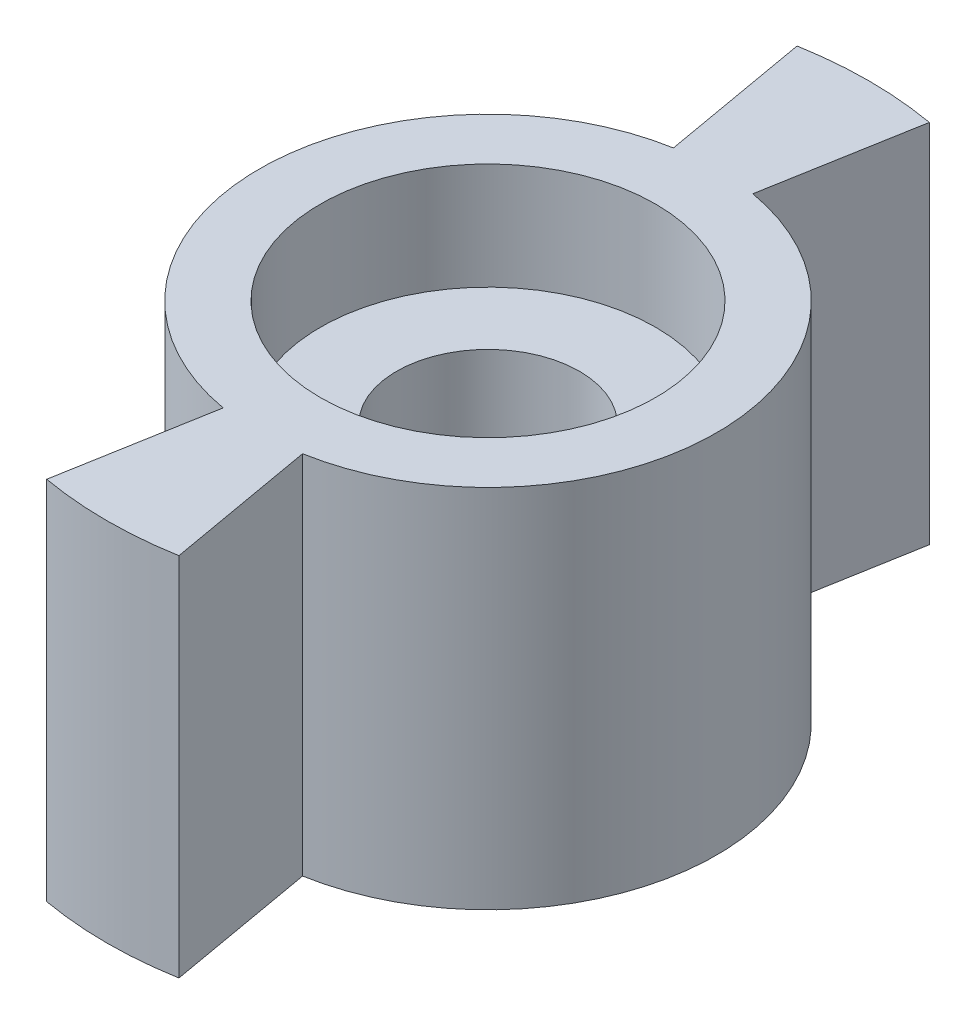
ISO-10303-21;
HEADER;
FILE_DESCRIPTION(('STEP AP214'),'2;1');
FILE_NAME('part.step','',(''),(''),'','','');
FILE_SCHEMA(('AUTOMOTIVE_DESIGN { 1 0 10303 214 1 1 1 1 }'));
ENDSEC;
DATA;
#1=APPLICATION_CONTEXT('core data for automotive mechanical design processes');
#2=APPLICATION_PROTOCOL_DEFINITION('international standard','automotive_design',2000,#1);
#3=PRODUCT_CONTEXT('',#1,'mechanical');
#4=PRODUCT('Part','Part','',(#3));
#5=PRODUCT_RELATED_PRODUCT_CATEGORY('part','',(#4));
#6=PRODUCT_DEFINITION_FORMATION('','',#4);
#7=PRODUCT_DEFINITION_CONTEXT('part definition',#1,'design');
#8=PRODUCT_DEFINITION('design','',#6,#7);
#9=PRODUCT_DEFINITION_SHAPE('','',#8);
#10=(LENGTH_UNIT() NAMED_UNIT(*) SI_UNIT(.MILLI.,.METRE.));
#11=(NAMED_UNIT(*) PLANE_ANGLE_UNIT() SI_UNIT($,.RADIAN.));
#12=(NAMED_UNIT(*) SI_UNIT($,.STERADIAN.) SOLID_ANGLE_UNIT());
#13=UNCERTAINTY_MEASURE_WITH_UNIT(LENGTH_MEASURE(1.E-05),#10,'distance_accuracy_value','');
#14=(GEOMETRIC_REPRESENTATION_CONTEXT(3) GLOBAL_UNCERTAINTY_ASSIGNED_CONTEXT((#13)) GLOBAL_UNIT_ASSIGNED_CONTEXT((#10,
#11,#12)) REPRESENTATION_CONTEXT('',''));
#15=CARTESIAN_POINT('',(0.,0.,0.));
#16=DIRECTION('',(0.,0.,1.));
#17=DIRECTION('',(1.,0.,0.));
#18=AXIS2_PLACEMENT_3D('',#15,#16,#17);
#19=CARTESIAN_POINT('',(11.,24.,0.));
#20=DIRECTION('',(0.,1.,0.));
#21=DIRECTION('',(0.,0.,1.));
#22=AXIS2_PLACEMENT_3D('',#19,#20,#21);
#23=PLANE('',#22);
#24=CARTESIAN_POINT('',(0.,24.,0.));
#25=DIRECTION('',(0.,-1.,0.));
#26=DIRECTION('',(0.,0.,-1.));
#27=AXIS2_PLACEMENT_3D('',#24,#25,#26);
#28=CIRCLE('',#27,11.);
#29=CARTESIAN_POINT('',(0.,24.,-11.));
#30=VERTEX_POINT('',#29);
#31=EDGE_CURVE('E129',#30,#30,#28,.T.);
#32=ORIENTED_EDGE('',*,*,#31,.T.);
#33=EDGE_LOOP('',(#32));
#34=FACE_BOUND('',#33,.T.);
#35=CARTESIAN_POINT('',(0.,24.,0.));
#36=DIRECTION('',(0.,1.,0.));
#37=DIRECTION('',(0.,0.,1.));
#38=AXIS2_PLACEMENT_3D('',#35,#36,#37);
#39=CIRCLE('',#38,15.);
#40=CARTESIAN_POINT('',(2.60472266500397,24.,14.7721162951831));
#41=VERTEX_POINT('',#40);
#42=CARTESIAN_POINT('',(2.60472266500396,24.,-14.7721162951831));
#43=VERTEX_POINT('',#42);
#44=EDGE_CURVE('E112',#41,#43,#39,.T.);
#45=ORIENTED_EDGE('',*,*,#44,.T.);
#46=DIRECTION('',(0.173648177666931,0.,-0.984807753012208));
#47=VECTOR('',#46,1.);
#48=CARTESIAN_POINT('',(0.,24.,0.));
#49=LINE('',#48,#47);
#50=CARTESIAN_POINT('',(4.34120444167327,24.,-24.6201938253052));
#51=VERTEX_POINT('',#50);
#52=EDGE_CURVE('E109',#43,#51,#49,.T.);
#53=ORIENTED_EDGE('',*,*,#52,.T.);
#54=CARTESIAN_POINT('',(0.,24.,0.));
#55=DIRECTION('',(0.,-1.,0.));
#56=DIRECTION('',(0.,0.,-1.));
#57=AXIS2_PLACEMENT_3D('',#54,#55,#56);
#58=CIRCLE('',#57,25.);
#59=CARTESIAN_POINT('',(-4.34120444167328,24.,-24.6201938253052));
#60=VERTEX_POINT('',#59);
#61=EDGE_CURVE('E167',#60,#51,#58,.T.);
#62=ORIENTED_EDGE('',*,*,#61,.F.);
#63=DIRECTION('',(-0.173648177666931,0.,-0.984807753012208));
#64=VECTOR('',#63,1.);
#65=CARTESIAN_POINT('',(0.,24.,0.));
#66=LINE('',#65,#64);
#67=CARTESIAN_POINT('',(-2.60472266500397,24.,-14.7721162951831));
#68=VERTEX_POINT('',#67);
#69=EDGE_CURVE('E136',#68,#60,#66,.T.);
#70=ORIENTED_EDGE('',*,*,#69,.F.);
#71=CARTESIAN_POINT('',(0.,24.,0.));
#72=DIRECTION('',(0.,1.,0.));
#73=DIRECTION('',(0.,0.,1.));
#74=AXIS2_PLACEMENT_3D('',#71,#72,#73);
#75=CIRCLE('',#74,15.);
#76=CARTESIAN_POINT('',(-2.60472266500396,24.,14.7721162951831));
#77=VERTEX_POINT('',#76);
#78=EDGE_CURVE('E133',#68,#77,#75,.T.);
#79=ORIENTED_EDGE('',*,*,#78,.T.);
#80=DIRECTION('',(-0.173648177666931,0.,0.984807753012208));
#81=VECTOR('',#80,1.);
#82=CARTESIAN_POINT('',(0.,24.,0.));
#83=LINE('',#82,#81);
#84=CARTESIAN_POINT('',(-4.34120444167327,24.,24.6201938253052));
#85=VERTEX_POINT('',#84);
#86=EDGE_CURVE('E138',#77,#85,#83,.T.);
#87=ORIENTED_EDGE('',*,*,#86,.T.);
#88=CARTESIAN_POINT('',(4.34120444167328,24.,24.6201938253052));
#89=VERTEX_POINT('',#88);
#90=EDGE_CURVE('E124',#89,#85,#58,.T.);
#91=ORIENTED_EDGE('',*,*,#90,.F.);
#92=DIRECTION('',(0.173648177666931,0.,0.984807753012208));
#93=VECTOR('',#92,1.);
#94=CARTESIAN_POINT('',(0.,24.,0.));
#95=LINE('',#94,#93);
#96=EDGE_CURVE('E105',#41,#89,#95,.T.);
#97=ORIENTED_EDGE('',*,*,#96,.F.);
#98=EDGE_LOOP('',(#45,#53,#62,#70,#79,#87,#91,#97));
#99=FACE_BOUND('',#98,.T.);
#100=ADVANCED_FACE('F39',(#34,#99),#23,.T.);
#101=CARTESIAN_POINT('',(0.,0.,0.));
#102=DIRECTION('',(0.,-1.,0.));
#103=DIRECTION('',(0.,0.,-1.));
#104=AXIS2_PLACEMENT_3D('',#101,#102,#103);
#105=CYLINDRICAL_SURFACE('',#104,25.);
#106=ORIENTED_EDGE('',*,*,#61,.T.);
#107=DIRECTION('',(0.,1.,0.));
#108=VECTOR('',#107,1.);
#109=CARTESIAN_POINT('',(4.34120444167327,-76.,-24.6201938253052));
#110=LINE('',#109,#108);
#111=CARTESIAN_POINT('',(4.34120444167327,0.,-24.6201938253052));
#112=VERTEX_POINT('',#111);
#113=EDGE_CURVE('E130',#112,#51,#110,.T.);
#114=ORIENTED_EDGE('',*,*,#113,.F.);
#115=CARTESIAN_POINT('',(0.,0.,0.));
#116=DIRECTION('',(0.,-1.,0.));
#117=DIRECTION('',(0.,0.,-1.));
#118=AXIS2_PLACEMENT_3D('',#115,#116,#117);
#119=CIRCLE('',#118,25.);
#120=CARTESIAN_POINT('',(-4.34120444167328,0.,-24.6201938253052));
#121=VERTEX_POINT('',#120);
#122=EDGE_CURVE('E163',#121,#112,#119,.T.);
#123=ORIENTED_EDGE('',*,*,#122,.F.);
#124=DIRECTION('',(0.,1.,0.));
#125=VECTOR('',#124,1.);
#126=CARTESIAN_POINT('',(-4.34120444167328,-76.,-24.6201938253052));
#127=LINE('',#126,#125);
#128=EDGE_CURVE('E53',#121,#60,#127,.T.);
#129=ORIENTED_EDGE('',*,*,#128,.T.);
#130=EDGE_LOOP('',(#106,#114,#123,#129));
#131=FACE_BOUND('',#130,.T.);
#132=ADVANCED_FACE('F188',(#131),#105,.T.);
#133=DIRECTION('',(0.,1.,0.));
#134=VECTOR('',#133,1.);
#135=CARTESIAN_POINT('',(4.34120444167328,-76.,24.6201938253052));
#136=LINE('',#135,#134);
#137=CARTESIAN_POINT('',(4.34120444167328,0.,24.6201938253052));
#138=VERTEX_POINT('',#137);
#139=EDGE_CURVE('E61',#138,#89,#136,.T.);
#140=ORIENTED_EDGE('',*,*,#139,.T.);
#141=ORIENTED_EDGE('',*,*,#90,.T.);
#142=DIRECTION('',(0.,1.,0.));
#143=VECTOR('',#142,1.);
#144=CARTESIAN_POINT('',(-4.34120444167327,-76.,24.6201938253052));
#145=LINE('',#144,#143);
#146=CARTESIAN_POINT('',(-4.34120444167327,0.,24.6201938253052));
#147=VERTEX_POINT('',#146);
#148=EDGE_CURVE('E142',#147,#85,#145,.T.);
#149=ORIENTED_EDGE('',*,*,#148,.F.);
#150=EDGE_CURVE('E166',#138,#147,#119,.T.);
#151=ORIENTED_EDGE('',*,*,#150,.F.);
#152=EDGE_LOOP('',(#140,#141,#149,#151));
#153=FACE_BOUND('',#152,.T.);
#154=ADVANCED_FACE('F200',(#153),#105,.T.);
#155=CARTESIAN_POINT('',(25.,0.,0.));
#156=DIRECTION('',(0.,-1.,0.));
#157=DIRECTION('',(0.,0.,-1.));
#158=AXIS2_PLACEMENT_3D('',#155,#156,#157);
#159=PLANE('',#158);
#160=CARTESIAN_POINT('',(0.,0.,0.));
#161=DIRECTION('',(0.,-1.,0.));
#162=DIRECTION('',(0.,0.,-1.));
#163=AXIS2_PLACEMENT_3D('',#160,#161,#162);
#164=CIRCLE('',#163,11.);
#165=CARTESIAN_POINT('',(0.,0.,-11.));
#166=VERTEX_POINT('',#165);
#167=EDGE_CURVE('E160',#166,#166,#164,.T.);
#168=ORIENTED_EDGE('',*,*,#167,.F.);
#169=EDGE_LOOP('',(#168));
#170=FACE_BOUND('',#169,.T.);
#171=ORIENTED_EDGE('',*,*,#122,.T.);
#172=DIRECTION('',(-0.173648177666931,0.,0.984807753012208));
#173=VECTOR('',#172,1.);
#174=CARTESIAN_POINT('',(0.753842240176147,0.,-4.27525179157087));
#175=LINE('',#174,#173);
#176=CARTESIAN_POINT('',(2.60472266500396,0.,-14.7721162951831));
#177=VERTEX_POINT('',#176);
#178=EDGE_CURVE('E12',#112,#177,#175,.T.);
#179=ORIENTED_EDGE('',*,*,#178,.T.);
#180=CARTESIAN_POINT('',(0.,0.,0.));
#181=DIRECTION('',(0.,-1.,0.));
#182=DIRECTION('',(0.,0.,-1.));
#183=AXIS2_PLACEMENT_3D('',#180,#181,#182);
#184=CIRCLE('',#183,15.);
#185=CARTESIAN_POINT('',(2.60472266500397,0.,14.7721162951831));
#186=VERTEX_POINT('',#185);
#187=EDGE_CURVE('E46',#177,#186,#184,.T.);
#188=ORIENTED_EDGE('',*,*,#187,.T.);
#189=DIRECTION('',(-0.173648177666931,0.,-0.984807753012208));
#190=VECTOR('',#189,1.);
#191=CARTESIAN_POINT('',(0.753842240176154,0.,4.27525179157088));
#192=LINE('',#191,#190);
#193=EDGE_CURVE('E106',#138,#186,#192,.T.);
#194=ORIENTED_EDGE('',*,*,#193,.F.);
#195=ORIENTED_EDGE('',*,*,#150,.T.);
#196=DIRECTION('',(0.173648177666931,0.,-0.984807753012208));
#197=VECTOR('',#196,1.);
#198=CARTESIAN_POINT('',(0.753842240176147,0.,-4.27525179157087));
#199=LINE('',#198,#197);
#200=CARTESIAN_POINT('',(-2.60472266500396,0.,14.7721162951831));
#201=VERTEX_POINT('',#200);
#202=EDGE_CURVE('E175',#147,#201,#199,.T.);
#203=ORIENTED_EDGE('',*,*,#202,.T.);
#204=CARTESIAN_POINT('',(0.,0.,0.));
#205=DIRECTION('',(0.,-1.,0.));
#206=DIRECTION('',(0.,0.,-1.));
#207=AXIS2_PLACEMENT_3D('',#204,#205,#206);
#208=CIRCLE('',#207,15.);
#209=CARTESIAN_POINT('',(-2.60472266500397,0.,-14.7721162951831));
#210=VERTEX_POINT('',#209);
#211=EDGE_CURVE('E172',#201,#210,#208,.T.);
#212=ORIENTED_EDGE('',*,*,#211,.T.);
#213=DIRECTION('',(0.173648177666931,0.,0.984807753012208));
#214=VECTOR('',#213,1.);
#215=CARTESIAN_POINT('',(0.753842240176154,0.,4.27525179157088));
#216=LINE('',#215,#214);
#217=EDGE_CURVE('E170',#121,#210,#216,.T.);
#218=ORIENTED_EDGE('',*,*,#217,.F.);
#219=EDGE_LOOP('',(#171,#179,#188,#194,#195,#203,#212,#218));
#220=FACE_BOUND('',#219,.T.);
#221=ADVANCED_FACE('F179',(#170,#220),#159,.T.);
#222=CARTESIAN_POINT('',(0.,0.,0.));
#223=DIRECTION('',(0.,-1.,0.));
#224=DIRECTION('',(0.,0.,-1.));
#225=AXIS2_PLACEMENT_3D('',#222,#223,#224);
#226=CYLINDRICAL_SURFACE('',#225,11.);
#227=ORIENTED_EDGE('',*,*,#167,.T.);
#228=EDGE_LOOP('',(#227));
#229=FACE_BOUND('',#228,.T.);
#230=CARTESIAN_POINT('',(0.,7.,0.));
#231=DIRECTION('',(0.,-1.,0.));
#232=DIRECTION('',(0.,0.,-1.));
#233=AXIS2_PLACEMENT_3D('',#230,#231,#232);
#234=CIRCLE('',#233,11.);
#235=CARTESIAN_POINT('',(0.,7.,-11.));
#236=VERTEX_POINT('',#235);
#237=EDGE_CURVE('E157',#236,#236,#234,.T.);
#238=ORIENTED_EDGE('',*,*,#237,.F.);
#239=EDGE_LOOP('',(#238));
#240=FACE_BOUND('',#239,.T.);
#241=ADVANCED_FACE('F236',(#229,#240),#226,.F.);
#242=CARTESIAN_POINT('',(11.,7.,0.));
#243=DIRECTION('',(0.,-1.,0.));
#244=DIRECTION('',(0.,0.,-1.));
#245=AXIS2_PLACEMENT_3D('',#242,#243,#244);
#246=PLANE('',#245);
#247=ORIENTED_EDGE('',*,*,#237,.T.);
#248=EDGE_LOOP('',(#247));
#249=FACE_BOUND('',#248,.T.);
#250=CARTESIAN_POINT('',(0.,7.,0.));
#251=DIRECTION('',(0.,-1.,0.));
#252=DIRECTION('',(0.,0.,-1.));
#253=AXIS2_PLACEMENT_3D('',#250,#251,#252);
#254=CIRCLE('',#253,6.);
#255=CARTESIAN_POINT('',(0.,7.,-6.));
#256=VERTEX_POINT('',#255);
#257=EDGE_CURVE('E154',#256,#256,#254,.T.);
#258=ORIENTED_EDGE('',*,*,#257,.F.);
#259=EDGE_LOOP('',(#258));
#260=FACE_BOUND('',#259,.T.);
#261=ADVANCED_FACE('F232',(#249,#260),#246,.T.);
#262=CARTESIAN_POINT('',(0.,0.,0.));
#263=DIRECTION('',(0.,-1.,0.));
#264=DIRECTION('',(0.,0.,-1.));
#265=AXIS2_PLACEMENT_3D('',#262,#263,#264);
#266=CYLINDRICAL_SURFACE('',#265,6.);
#267=ORIENTED_EDGE('',*,*,#257,.T.);
#268=EDGE_LOOP('',(#267));
#269=FACE_BOUND('',#268,.T.);
#270=CARTESIAN_POINT('',(0.,17.,0.));
#271=DIRECTION('',(0.,-1.,0.));
#272=DIRECTION('',(0.,0.,-1.));
#273=AXIS2_PLACEMENT_3D('',#270,#271,#272);
#274=CIRCLE('',#273,6.);
#275=CARTESIAN_POINT('',(0.,17.,-6.));
#276=VERTEX_POINT('',#275);
#277=EDGE_CURVE('E151',#276,#276,#274,.T.);
#278=ORIENTED_EDGE('',*,*,#277,.F.);
#279=EDGE_LOOP('',(#278));
#280=FACE_BOUND('',#279,.T.);
#281=ADVANCED_FACE('F226',(#269,#280),#266,.F.);
#282=CARTESIAN_POINT('',(6.,17.,0.));
#283=DIRECTION('',(0.,1.,0.));
#284=DIRECTION('',(0.,0.,1.));
#285=AXIS2_PLACEMENT_3D('',#282,#283,#284);
#286=PLANE('',#285);
#287=ORIENTED_EDGE('',*,*,#277,.T.);
#288=EDGE_LOOP('',(#287));
#289=FACE_BOUND('',#288,.T.);
#290=CARTESIAN_POINT('',(0.,17.,0.));
#291=DIRECTION('',(0.,-1.,0.));
#292=DIRECTION('',(0.,0.,-1.));
#293=AXIS2_PLACEMENT_3D('',#290,#291,#292);
#294=CIRCLE('',#293,11.);
#295=CARTESIAN_POINT('',(0.,17.,-11.));
#296=VERTEX_POINT('',#295);
#297=EDGE_CURVE('E148',#296,#296,#294,.T.);
#298=ORIENTED_EDGE('',*,*,#297,.F.);
#299=EDGE_LOOP('',(#298));
#300=FACE_BOUND('',#299,.T.);
#301=ADVANCED_FACE('F220',(#289,#300),#286,.T.);
#302=CARTESIAN_POINT('',(0.,0.,0.));
#303=DIRECTION('',(0.,-1.,0.));
#304=DIRECTION('',(0.,0.,-1.));
#305=AXIS2_PLACEMENT_3D('',#302,#303,#304);
#306=CYLINDRICAL_SURFACE('',#305,11.);
#307=ORIENTED_EDGE('',*,*,#297,.T.);
#308=EDGE_LOOP('',(#307));
#309=FACE_BOUND('',#308,.T.);
#310=ORIENTED_EDGE('',*,*,#31,.F.);
#311=EDGE_LOOP('',(#310));
#312=FACE_BOUND('',#311,.T.);
#313=ADVANCED_FACE('F209',(#309,#312),#306,.F.);
#314=CARTESIAN_POINT('',(0.,-76.,0.));
#315=DIRECTION('',(0.,1.,0.));
#316=DIRECTION('',(0.,0.,1.));
#317=AXIS2_PLACEMENT_3D('',#314,#315,#316);
#318=CYLINDRICAL_SURFACE('',#317,15.);
#319=DIRECTION('',(0.,1.,0.));
#320=VECTOR('',#319,1.);
#321=CARTESIAN_POINT('',(-2.60472266500396,-76.,14.7721162951831));
#322=LINE('',#321,#320);
#323=EDGE_CURVE('E119',#201,#77,#322,.T.);
#324=ORIENTED_EDGE('',*,*,#323,.T.);
#325=ORIENTED_EDGE('',*,*,#78,.F.);
#326=DIRECTION('',(0.,1.,0.));
#327=VECTOR('',#326,1.);
#328=CARTESIAN_POINT('',(-2.60472266500397,-76.,-14.7721162951831));
#329=LINE('',#328,#327);
#330=EDGE_CURVE('E140',#210,#68,#329,.T.);
#331=ORIENTED_EDGE('',*,*,#330,.F.);
#332=ORIENTED_EDGE('',*,*,#211,.F.);
#333=EDGE_LOOP('',(#324,#325,#331,#332));
#334=FACE_BOUND('',#333,.T.);
#335=ADVANCED_FACE('F194',(#334),#318,.T.);
#336=CARTESIAN_POINT('',(0.,-76.,0.));
#337=DIRECTION('',(-0.984807753012208,0.,-0.173648177666931));
#338=DIRECTION('',(-0.173648177666931,0.,0.984807753012208));
#339=AXIS2_PLACEMENT_3D('',#336,#337,#338);
#340=PLANE('',#339);
#341=ORIENTED_EDGE('',*,*,#148,.T.);
#342=ORIENTED_EDGE('',*,*,#86,.F.);
#343=ORIENTED_EDGE('',*,*,#323,.F.);
#344=ORIENTED_EDGE('',*,*,#202,.F.);
#345=EDGE_LOOP('',(#341,#342,#343,#344));
#346=FACE_BOUND('',#345,.T.);
#347=ADVANCED_FACE('F201',(#346),#340,.T.);
#348=CARTESIAN_POINT('',(0.,-76.,0.));
#349=DIRECTION('',(0.984807753012208,0.,-0.173648177666931));
#350=DIRECTION('',(-0.173648177666931,0.,-0.984807753012208));
#351=AXIS2_PLACEMENT_3D('',#348,#349,#350);
#352=PLANE('',#351);
#353=ORIENTED_EDGE('',*,*,#217,.T.);
#354=ORIENTED_EDGE('',*,*,#330,.T.);
#355=ORIENTED_EDGE('',*,*,#69,.T.);
#356=ORIENTED_EDGE('',*,*,#128,.F.);
#357=EDGE_LOOP('',(#353,#354,#355,#356));
#358=FACE_BOUND('',#357,.T.);
#359=ADVANCED_FACE('F191',(#358),#352,.F.);
#360=CARTESIAN_POINT('',(0.,-76.,0.));
#361=DIRECTION('',(0.,1.,0.));
#362=DIRECTION('',(0.,0.,1.));
#363=AXIS2_PLACEMENT_3D('',#360,#361,#362);
#364=CYLINDRICAL_SURFACE('',#363,15.);
#365=DIRECTION('',(0.,1.,0.));
#366=VECTOR('',#365,1.);
#367=CARTESIAN_POINT('',(2.60472266500396,-76.,-14.7721162951831));
#368=LINE('',#367,#366);
#369=EDGE_CURVE('E115',#177,#43,#368,.T.);
#370=ORIENTED_EDGE('',*,*,#369,.T.);
#371=ORIENTED_EDGE('',*,*,#44,.F.);
#372=DIRECTION('',(0.,1.,0.));
#373=VECTOR('',#372,1.);
#374=CARTESIAN_POINT('',(2.60472266500397,-76.,14.7721162951831));
#375=LINE('',#374,#373);
#376=EDGE_CURVE('E101',#186,#41,#375,.T.);
#377=ORIENTED_EDGE('',*,*,#376,.F.);
#378=ORIENTED_EDGE('',*,*,#187,.F.);
#379=EDGE_LOOP('',(#370,#371,#377,#378));
#380=FACE_BOUND('',#379,.T.);
#381=ADVANCED_FACE('F113',(#380),#364,.T.);
#382=CARTESIAN_POINT('',(0.,-76.,0.));
#383=DIRECTION('',(0.984807753012208,0.,0.173648177666931));
#384=DIRECTION('',(0.173648177666931,0.,-0.984807753012208));
#385=AXIS2_PLACEMENT_3D('',#382,#383,#384);
#386=PLANE('',#385);
#387=ORIENTED_EDGE('',*,*,#113,.T.);
#388=ORIENTED_EDGE('',*,*,#52,.F.);
#389=ORIENTED_EDGE('',*,*,#369,.F.);
#390=ORIENTED_EDGE('',*,*,#178,.F.);
#391=EDGE_LOOP('',(#387,#388,#389,#390));
#392=FACE_BOUND('',#391,.T.);
#393=ADVANCED_FACE('F183',(#392),#386,.T.);
#394=CARTESIAN_POINT('',(0.,-76.,0.));
#395=DIRECTION('',(-0.984807753012208,0.,0.173648177666931));
#396=DIRECTION('',(0.173648177666931,0.,0.984807753012208));
#397=AXIS2_PLACEMENT_3D('',#394,#395,#396);
#398=PLANE('',#397);
#399=ORIENTED_EDGE('',*,*,#193,.T.);
#400=ORIENTED_EDGE('',*,*,#376,.T.);
#401=ORIENTED_EDGE('',*,*,#96,.T.);
#402=ORIENTED_EDGE('',*,*,#139,.F.);
#403=EDGE_LOOP('',(#399,#400,#401,#402));
#404=FACE_BOUND('',#403,.T.);
#405=ADVANCED_FACE('F103',(#404),#398,.F.);
#406=CLOSED_SHELL('',(#100,#132,#154,#221,#241,#261,#281,#301,#313,#335,#347,#359,#381,#393,#405));
#407=MANIFOLD_SOLID_BREP('B2',#406);
#408=ADVANCED_BREP_SHAPE_REPRESENTATION('',(#18,#407),#14);
#409=SHAPE_DEFINITION_REPRESENTATION(#9,#408);
ENDSEC;
END-ISO-10303-21;
